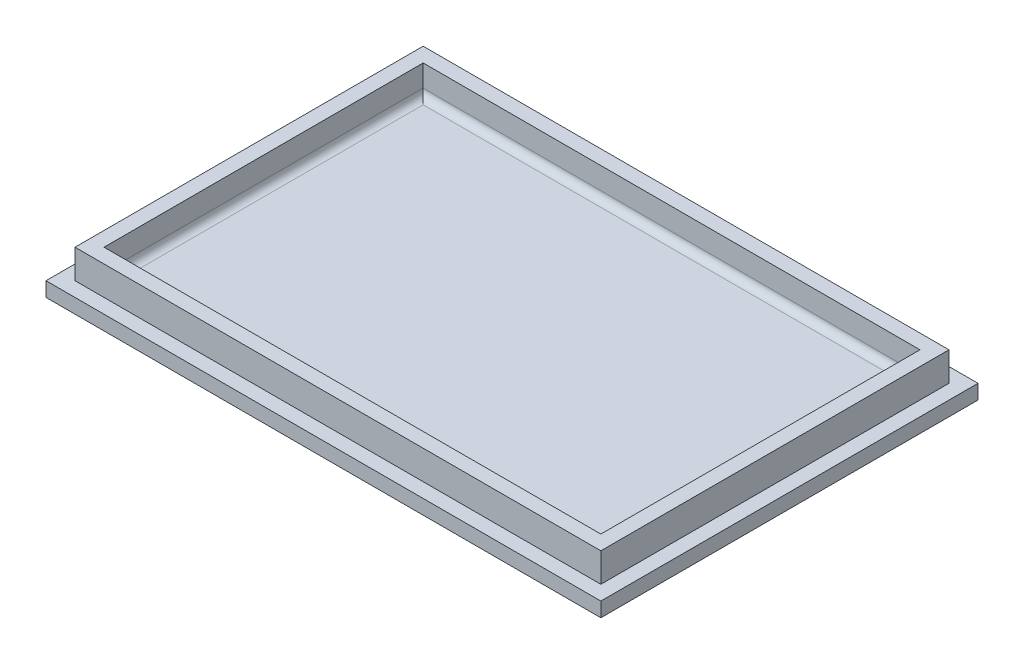
ISO-10303-21;
HEADER;
FILE_DESCRIPTION(('STEP AP214'),'2;1');
FILE_NAME('part.step','',(''),(''),'','','');
FILE_SCHEMA(('AUTOMOTIVE_DESIGN { 1 0 10303 214 1 1 1 1 }'));
ENDSEC;
DATA;
#1=APPLICATION_CONTEXT('core data for automotive mechanical design processes');
#2=APPLICATION_PROTOCOL_DEFINITION('international standard','automotive_design',2000,#1);
#3=PRODUCT_CONTEXT('',#1,'mechanical');
#4=PRODUCT('Part','Part','',(#3));
#5=PRODUCT_RELATED_PRODUCT_CATEGORY('part','',(#4));
#6=PRODUCT_DEFINITION_FORMATION('','',#4);
#7=PRODUCT_DEFINITION_CONTEXT('part definition',#1,'design');
#8=PRODUCT_DEFINITION('design','',#6,#7);
#9=PRODUCT_DEFINITION_SHAPE('','',#8);
#10=(LENGTH_UNIT() NAMED_UNIT(*) SI_UNIT(.MILLI.,.METRE.));
#11=(NAMED_UNIT(*) PLANE_ANGLE_UNIT() SI_UNIT($,.RADIAN.));
#12=(NAMED_UNIT(*) SI_UNIT($,.STERADIAN.) SOLID_ANGLE_UNIT());
#13=UNCERTAINTY_MEASURE_WITH_UNIT(LENGTH_MEASURE(1.E-05),#10,'distance_accuracy_value','');
#14=(GEOMETRIC_REPRESENTATION_CONTEXT(3) GLOBAL_UNCERTAINTY_ASSIGNED_CONTEXT((#13)) GLOBAL_UNIT_ASSIGNED_CONTEXT((#10,
#11,#12)) REPRESENTATION_CONTEXT('',''));
#15=CARTESIAN_POINT('',(0.,0.,0.));
#16=DIRECTION('',(0.,0.,1.));
#17=DIRECTION('',(1.,0.,0.));
#18=AXIS2_PLACEMENT_3D('',#15,#16,#17);
#19=CARTESIAN_POINT('',(0.,2.,0.));
#20=DIRECTION('',(0.,1.,0.));
#21=DIRECTION('',(0.,0.,1.));
#22=AXIS2_PLACEMENT_3D('',#19,#20,#21);
#23=PLANE('',#22);
#24=DIRECTION('',(0.,0.,1.));
#25=VECTOR('',#24,1.);
#26=CARTESIAN_POINT('',(-54.8143177737881,2.,-27.6349192100539));
#27=LINE('',#26,#25);
#28=CARTESIAN_POINT('',(-54.8143177737881,2.,-27.6349192100539));
#29=VERTEX_POINT('',#28);
#30=CARTESIAN_POINT('',(-54.8143177737881,2.,24.3650807899461));
#31=VERTEX_POINT('',#30);
#32=EDGE_CURVE('E223',#29,#31,#27,.T.);
#33=ORIENTED_EDGE('',*,*,#32,.T.);
#34=DIRECTION('',(1.,0.,0.));
#35=VECTOR('',#34,1.);
#36=CARTESIAN_POINT('',(-54.8143177737881,2.,24.3650807899461));
#37=LINE('',#36,#35);
#38=CARTESIAN_POINT('',(21.6856822262118,2.,24.3650807899461));
#39=VERTEX_POINT('',#38);
#40=EDGE_CURVE('E227',#31,#39,#37,.T.);
#41=ORIENTED_EDGE('',*,*,#40,.T.);
#42=DIRECTION('',(0.,0.,-1.));
#43=VECTOR('',#42,1.);
#44=CARTESIAN_POINT('',(21.6856822262118,2.,-27.6349192100539));
#45=LINE('',#44,#43);
#46=CARTESIAN_POINT('',(21.6856822262118,2.,-27.6349192100539));
#47=VERTEX_POINT('',#46);
#48=EDGE_CURVE('E231',#39,#47,#45,.T.);
#49=ORIENTED_EDGE('',*,*,#48,.T.);
#50=DIRECTION('',(-1.,0.,0.));
#51=VECTOR('',#50,1.);
#52=CARTESIAN_POINT('',(-54.8143177737881,2.,-27.6349192100539));
#53=LINE('',#52,#51);
#54=EDGE_CURVE('E234',#47,#29,#53,.T.);
#55=ORIENTED_EDGE('',*,*,#54,.T.);
#56=EDGE_LOOP('',(#33,#41,#49,#55));
#57=FACE_BOUND('',#56,.T.);
#58=DIRECTION('',(1.,0.,0.));
#59=VECTOR('',#58,1.);
#60=CARTESIAN_POINT('',(-52.8143177737881,2.,22.3650807899461));
#61=LINE('',#60,#59);
#62=CARTESIAN_POINT('',(-52.8143177737881,2.,22.3650807899461));
#63=VERTEX_POINT('',#62);
#64=CARTESIAN_POINT('',(19.6856822262119,2.,22.3650807899461));
#65=VERTEX_POINT('',#64);
#66=EDGE_CURVE('E200',#63,#65,#61,.T.);
#67=ORIENTED_EDGE('',*,*,#66,.F.);
#68=DIRECTION('',(0.,0.,1.));
#69=VECTOR('',#68,1.);
#70=CARTESIAN_POINT('',(-52.8143177737881,2.,-25.6349192100539));
#71=LINE('',#70,#69);
#72=CARTESIAN_POINT('',(-52.8143177737881,2.,-25.6349192100539));
#73=VERTEX_POINT('',#72);
#74=EDGE_CURVE('E160',#73,#63,#71,.T.);
#75=ORIENTED_EDGE('',*,*,#74,.F.);
#76=DIRECTION('',(-1.,0.,0.));
#77=VECTOR('',#76,1.);
#78=CARTESIAN_POINT('',(-52.8143177737881,2.,-25.6349192100539));
#79=LINE('',#78,#77);
#80=CARTESIAN_POINT('',(19.6856822262118,2.,-25.6349192100539));
#81=VERTEX_POINT('',#80);
#82=EDGE_CURVE('E187',#81,#73,#79,.T.);
#83=ORIENTED_EDGE('',*,*,#82,.F.);
#84=DIRECTION('',(0.,0.,-1.));
#85=VECTOR('',#84,1.);
#86=CARTESIAN_POINT('',(19.6856822262118,2.,-25.6349192100539));
#87=LINE('',#86,#85);
#88=EDGE_CURVE('E203',#65,#81,#87,.T.);
#89=ORIENTED_EDGE('',*,*,#88,.F.);
#90=EDGE_LOOP('',(#67,#75,#83,#89));
#91=FACE_BOUND('',#90,.T.);
#92=ADVANCED_FACE('F39',(#57,#91),#23,.T.);
#93=CARTESIAN_POINT('',(-54.8143177737881,2.,-27.6349192100539));
#94=DIRECTION('',(1.,0.,0.));
#95=DIRECTION('',(0.,0.,-1.));
#96=AXIS2_PLACEMENT_3D('',#93,#94,#95);
#97=PLANE('',#96);
#98=DIRECTION('',(0.,0.,1.));
#99=VECTOR('',#98,1.);
#100=CARTESIAN_POINT('',(-54.8143177737881,0.,-27.6349192100539));
#101=LINE('',#100,#99);
#102=CARTESIAN_POINT('',(-54.8143177737881,0.,-27.6349192100539));
#103=VERTEX_POINT('',#102);
#104=CARTESIAN_POINT('',(-54.8143177737881,0.,24.3650807899461));
#105=VERTEX_POINT('',#104);
#106=EDGE_CURVE('E222',#103,#105,#101,.T.);
#107=ORIENTED_EDGE('',*,*,#106,.T.);
#108=DIRECTION('',(0.,-1.,0.));
#109=VECTOR('',#108,1.);
#110=CARTESIAN_POINT('',(-54.8143177737881,2.,24.3650807899461));
#111=LINE('',#110,#109);
#112=EDGE_CURVE('E260',#31,#105,#111,.T.);
#113=ORIENTED_EDGE('',*,*,#112,.F.);
#114=ORIENTED_EDGE('',*,*,#32,.F.);
#115=DIRECTION('',(0.,-1.,0.));
#116=VECTOR('',#115,1.);
#117=CARTESIAN_POINT('',(-54.8143177737881,2.,-27.6349192100539));
#118=LINE('',#117,#116);
#119=EDGE_CURVE('E237',#29,#103,#118,.T.);
#120=ORIENTED_EDGE('',*,*,#119,.T.);
#121=EDGE_LOOP('',(#107,#113,#114,#120));
#122=FACE_BOUND('',#121,.T.);
#123=ADVANCED_FACE('F324',(#122),#97,.F.);
#124=CARTESIAN_POINT('',(-54.8143177737881,2.,24.3650807899461));
#125=DIRECTION('',(0.,0.,-1.));
#126=DIRECTION('',(-1.,0.,0.));
#127=AXIS2_PLACEMENT_3D('',#124,#125,#126);
#128=PLANE('',#127);
#129=DIRECTION('',(1.,0.,0.));
#130=VECTOR('',#129,1.);
#131=CARTESIAN_POINT('',(-54.8143177737881,0.,24.3650807899461));
#132=LINE('',#131,#130);
#133=CARTESIAN_POINT('',(21.6856822262118,0.,24.3650807899461));
#134=VERTEX_POINT('',#133);
#135=EDGE_CURVE('E241',#105,#134,#132,.T.);
#136=ORIENTED_EDGE('',*,*,#135,.T.);
#137=DIRECTION('',(0.,-1.,0.));
#138=VECTOR('',#137,1.);
#139=CARTESIAN_POINT('',(21.6856822262118,2.,24.3650807899461));
#140=LINE('',#139,#138);
#141=EDGE_CURVE('E256',#39,#134,#140,.T.);
#142=ORIENTED_EDGE('',*,*,#141,.F.);
#143=ORIENTED_EDGE('',*,*,#40,.F.);
#144=ORIENTED_EDGE('',*,*,#112,.T.);
#145=EDGE_LOOP('',(#136,#142,#143,#144));
#146=FACE_BOUND('',#145,.T.);
#147=ADVANCED_FACE('F329',(#146),#128,.F.);
#148=CARTESIAN_POINT('',(21.6856822262118,2.,-27.6349192100539));
#149=DIRECTION('',(-1.,0.,0.));
#150=DIRECTION('',(0.,0.,1.));
#151=AXIS2_PLACEMENT_3D('',#148,#149,#150);
#152=PLANE('',#151);
#153=DIRECTION('',(0.,0.,-1.));
#154=VECTOR('',#153,1.);
#155=CARTESIAN_POINT('',(21.6856822262118,0.,-27.6349192100539));
#156=LINE('',#155,#154);
#157=CARTESIAN_POINT('',(21.6856822262118,0.,-27.6349192100539));
#158=VERTEX_POINT('',#157);
#159=EDGE_CURVE('E244',#134,#158,#156,.T.);
#160=ORIENTED_EDGE('',*,*,#159,.T.);
#161=DIRECTION('',(0.,-1.,0.));
#162=VECTOR('',#161,1.);
#163=CARTESIAN_POINT('',(21.6856822262118,2.,-27.6349192100539));
#164=LINE('',#163,#162);
#165=EDGE_CURVE('E252',#47,#158,#164,.T.);
#166=ORIENTED_EDGE('',*,*,#165,.F.);
#167=ORIENTED_EDGE('',*,*,#48,.F.);
#168=ORIENTED_EDGE('',*,*,#141,.T.);
#169=EDGE_LOOP('',(#160,#166,#167,#168));
#170=FACE_BOUND('',#169,.T.);
#171=ADVANCED_FACE('F379',(#170),#152,.F.);
#172=CARTESIAN_POINT('',(-54.8143177737881,2.,-27.6349192100539));
#173=DIRECTION('',(0.,0.,1.));
#174=DIRECTION('',(1.,0.,0.));
#175=AXIS2_PLACEMENT_3D('',#172,#173,#174);
#176=PLANE('',#175);
#177=DIRECTION('',(-1.,0.,0.));
#178=VECTOR('',#177,1.);
#179=CARTESIAN_POINT('',(-54.8143177737881,0.,-27.6349192100539));
#180=LINE('',#179,#178);
#181=EDGE_CURVE('E228',#158,#103,#180,.T.);
#182=ORIENTED_EDGE('',*,*,#181,.T.);
#183=ORIENTED_EDGE('',*,*,#119,.F.);
#184=ORIENTED_EDGE('',*,*,#54,.F.);
#185=ORIENTED_EDGE('',*,*,#165,.T.);
#186=EDGE_LOOP('',(#182,#183,#184,#185));
#187=FACE_BOUND('',#186,.T.);
#188=ADVANCED_FACE('F374',(#187),#176,.F.);
#189=CARTESIAN_POINT('',(0.,0.,0.));
#190=DIRECTION('',(0.,1.,0.));
#191=DIRECTION('',(0.,0.,1.));
#192=AXIS2_PLACEMENT_3D('',#189,#190,#191);
#193=PLANE('',#192);
#194=ORIENTED_EDGE('',*,*,#106,.F.);
#195=ORIENTED_EDGE('',*,*,#181,.F.);
#196=ORIENTED_EDGE('',*,*,#159,.F.);
#197=ORIENTED_EDGE('',*,*,#135,.F.);
#198=EDGE_LOOP('',(#194,#195,#196,#197));
#199=FACE_BOUND('',#198,.T.);
#200=ADVANCED_FACE('F370',(#199),#193,.F.);
#201=CARTESIAN_POINT('',(0.,6.,0.));
#202=DIRECTION('',(0.,1.,0.));
#203=DIRECTION('',(0.,0.,1.));
#204=AXIS2_PLACEMENT_3D('',#201,#202,#203);
#205=PLANE('',#204);
#206=DIRECTION('',(0.,0.,1.));
#207=VECTOR('',#206,1.);
#208=CARTESIAN_POINT('',(-52.8143177737881,6.,-25.6349192100539));
#209=LINE('',#208,#207);
#210=CARTESIAN_POINT('',(-52.8143177737881,6.,-25.6349192100539));
#211=VERTEX_POINT('',#210);
#212=CARTESIAN_POINT('',(-52.8143177737881,6.,22.3650807899461));
#213=VERTEX_POINT('',#212);
#214=EDGE_CURVE('E182',#211,#213,#209,.T.);
#215=ORIENTED_EDGE('',*,*,#214,.T.);
#216=DIRECTION('',(1.,0.,0.));
#217=VECTOR('',#216,1.);
#218=CARTESIAN_POINT('',(-52.8143177737881,6.,22.3650807899461));
#219=LINE('',#218,#217);
#220=CARTESIAN_POINT('',(19.6856822262119,6.,22.3650807899461));
#221=VERTEX_POINT('',#220);
#222=EDGE_CURVE('E186',#213,#221,#219,.T.);
#223=ORIENTED_EDGE('',*,*,#222,.T.);
#224=DIRECTION('',(0.,0.,-1.));
#225=VECTOR('',#224,1.);
#226=CARTESIAN_POINT('',(19.6856822262118,6.,-25.6349192100539));
#227=LINE('',#226,#225);
#228=CARTESIAN_POINT('',(19.6856822262118,6.,-25.6349192100539));
#229=VERTEX_POINT('',#228);
#230=EDGE_CURVE('E190',#221,#229,#227,.T.);
#231=ORIENTED_EDGE('',*,*,#230,.T.);
#232=DIRECTION('',(-1.,0.,0.));
#233=VECTOR('',#232,1.);
#234=CARTESIAN_POINT('',(-52.8143177737881,6.,-25.6349192100539));
#235=LINE('',#234,#233);
#236=EDGE_CURVE('E193',#229,#211,#235,.T.);
#237=ORIENTED_EDGE('',*,*,#236,.T.);
#238=EDGE_LOOP('',(#215,#223,#231,#237));
#239=FACE_BOUND('',#238,.T.);
#240=DIRECTION('',(1.,0.,0.));
#241=VECTOR('',#240,1.);
#242=CARTESIAN_POINT('',(-50.8143177737881,6.,20.3650807899461));
#243=LINE('',#242,#241);
#244=CARTESIAN_POINT('',(-50.8143177737881,6.,20.3650807899461));
#245=VERTEX_POINT('',#244);
#246=CARTESIAN_POINT('',(17.6856822262119,6.,20.3650807899461));
#247=VERTEX_POINT('',#246);
#248=EDGE_CURVE('E150',#245,#247,#243,.T.);
#249=ORIENTED_EDGE('',*,*,#248,.F.);
#250=DIRECTION('',(0.,0.,1.));
#251=VECTOR('',#250,1.);
#252=CARTESIAN_POINT('',(-50.8143177737881,6.,-23.6349192100539));
#253=LINE('',#252,#251);
#254=CARTESIAN_POINT('',(-50.8143177737881,6.,-23.6349192100539));
#255=VERTEX_POINT('',#254);
#256=EDGE_CURVE('E141',#255,#245,#253,.T.);
#257=ORIENTED_EDGE('',*,*,#256,.F.);
#258=DIRECTION('',(-1.,0.,0.));
#259=VECTOR('',#258,1.);
#260=CARTESIAN_POINT('',(-50.8143177737881,6.,-23.6349192100539));
#261=LINE('',#260,#259);
#262=CARTESIAN_POINT('',(17.6856822262118,6.,-23.6349192100539));
#263=VERTEX_POINT('',#262);
#264=EDGE_CURVE('E170',#263,#255,#261,.T.);
#265=ORIENTED_EDGE('',*,*,#264,.F.);
#266=DIRECTION('',(0.,0.,-1.));
#267=VECTOR('',#266,1.);
#268=CARTESIAN_POINT('',(17.6856822262118,6.,-23.6349192100539));
#269=LINE('',#268,#267);
#270=EDGE_CURVE('E166',#247,#263,#269,.T.);
#271=ORIENTED_EDGE('',*,*,#270,.F.);
#272=EDGE_LOOP('',(#249,#257,#265,#271));
#273=FACE_BOUND('',#272,.T.);
#274=ADVANCED_FACE('F164',(#239,#273),#205,.T.);
#275=CARTESIAN_POINT('',(-52.8143177737881,6.,-25.6349192100539));
#276=DIRECTION('',(1.,0.,0.));
#277=DIRECTION('',(0.,0.,-1.));
#278=AXIS2_PLACEMENT_3D('',#275,#276,#277);
#279=PLANE('',#278);
#280=ORIENTED_EDGE('',*,*,#74,.T.);
#281=DIRECTION('',(0.,-1.,0.));
#282=VECTOR('',#281,1.);
#283=CARTESIAN_POINT('',(-52.8143177737881,6.,22.3650807899461));
#284=LINE('',#283,#282);
#285=EDGE_CURVE('E219',#213,#63,#284,.T.);
#286=ORIENTED_EDGE('',*,*,#285,.F.);
#287=ORIENTED_EDGE('',*,*,#214,.F.);
#288=DIRECTION('',(0.,-1.,0.));
#289=VECTOR('',#288,1.);
#290=CARTESIAN_POINT('',(-52.8143177737881,6.,-25.6349192100539));
#291=LINE('',#290,#289);
#292=EDGE_CURVE('E196',#211,#73,#291,.T.);
#293=ORIENTED_EDGE('',*,*,#292,.T.);
#294=EDGE_LOOP('',(#280,#286,#287,#293));
#295=FACE_BOUND('',#294,.T.);
#296=ADVANCED_FACE('F352',(#295),#279,.F.);
#297=CARTESIAN_POINT('',(-52.8143177737881,6.,22.3650807899461));
#298=DIRECTION('',(0.,0.,-1.));
#299=DIRECTION('',(-1.,0.,0.));
#300=AXIS2_PLACEMENT_3D('',#297,#298,#299);
#301=PLANE('',#300);
#302=ORIENTED_EDGE('',*,*,#66,.T.);
#303=DIRECTION('',(0.,-1.,0.));
#304=VECTOR('',#303,1.);
#305=CARTESIAN_POINT('',(19.6856822262119,6.,22.3650807899461));
#306=LINE('',#305,#304);
#307=EDGE_CURVE('E215',#221,#65,#306,.T.);
#308=ORIENTED_EDGE('',*,*,#307,.F.);
#309=ORIENTED_EDGE('',*,*,#222,.F.);
#310=ORIENTED_EDGE('',*,*,#285,.T.);
#311=EDGE_LOOP('',(#302,#308,#309,#310));
#312=FACE_BOUND('',#311,.T.);
#313=ADVANCED_FACE('F341',(#312),#301,.F.);
#314=CARTESIAN_POINT('',(19.6856822262118,6.,-25.6349192100539));
#315=DIRECTION('',(-1.,0.,0.));
#316=DIRECTION('',(0.,0.,1.));
#317=AXIS2_PLACEMENT_3D('',#314,#315,#316);
#318=PLANE('',#317);
#319=ORIENTED_EDGE('',*,*,#88,.T.);
#320=DIRECTION('',(0.,-1.,0.));
#321=VECTOR('',#320,1.);
#322=CARTESIAN_POINT('',(19.6856822262118,6.,-25.6349192100539));
#323=LINE('',#322,#321);
#324=EDGE_CURVE('E212',#229,#81,#323,.T.);
#325=ORIENTED_EDGE('',*,*,#324,.F.);
#326=ORIENTED_EDGE('',*,*,#230,.F.);
#327=ORIENTED_EDGE('',*,*,#307,.T.);
#328=EDGE_LOOP('',(#319,#325,#326,#327));
#329=FACE_BOUND('',#328,.T.);
#330=ADVANCED_FACE('F345',(#329),#318,.F.);
#331=CARTESIAN_POINT('',(-52.8143177737881,6.,-25.6349192100539));
#332=DIRECTION('',(0.,0.,1.));
#333=DIRECTION('',(1.,0.,0.));
#334=AXIS2_PLACEMENT_3D('',#331,#332,#333);
#335=PLANE('',#334);
#336=ORIENTED_EDGE('',*,*,#82,.T.);
#337=ORIENTED_EDGE('',*,*,#292,.F.);
#338=ORIENTED_EDGE('',*,*,#236,.F.);
#339=ORIENTED_EDGE('',*,*,#324,.T.);
#340=EDGE_LOOP('',(#336,#337,#338,#339));
#341=FACE_BOUND('',#340,.T.);
#342=ADVANCED_FACE('F354',(#341),#335,.F.);
#343=CARTESIAN_POINT('',(-50.8143177737881,6.,-23.6349192100539));
#344=DIRECTION('',(1.,0.,0.));
#345=DIRECTION('',(0.,0.,-1.));
#346=AXIS2_PLACEMENT_3D('',#343,#344,#345);
#347=PLANE('',#346);
#348=DIRECTION('',(0.,-1.,0.));
#349=VECTOR('',#348,1.);
#350=CARTESIAN_POINT('',(-50.8143177737881,6.,20.3650807899461));
#351=LINE('',#350,#349);
#352=CARTESIAN_POINT('',(-50.8143177737881,3.,20.3650807899461));
#353=VERTEX_POINT('',#352);
#354=EDGE_CURVE('E144',#245,#353,#351,.T.);
#355=ORIENTED_EDGE('',*,*,#354,.T.);
#356=DIRECTION('',(0.,0.,1.));
#357=VECTOR('',#356,1.);
#358=CARTESIAN_POINT('',(-50.8143177737881,3.,-23.6349192100539));
#359=LINE('',#358,#357);
#360=CARTESIAN_POINT('',(-50.8143177737881,3.,-23.6349192100539));
#361=VERTEX_POINT('',#360);
#362=EDGE_CURVE('E63',#353,#361,#359,.F.);
#363=ORIENTED_EDGE('',*,*,#362,.T.);
#364=DIRECTION('',(0.,-1.,0.));
#365=VECTOR('',#364,1.);
#366=CARTESIAN_POINT('',(-50.8143177737881,6.,-23.6349192100539));
#367=LINE('',#366,#365);
#368=EDGE_CURVE('E145',#255,#361,#367,.T.);
#369=ORIENTED_EDGE('',*,*,#368,.F.);
#370=ORIENTED_EDGE('',*,*,#256,.T.);
#371=EDGE_LOOP('',(#355,#363,#369,#370));
#372=FACE_BOUND('',#371,.T.);
#373=ADVANCED_FACE('F143',(#372),#347,.T.);
#374=CARTESIAN_POINT('',(-50.8143177737881,6.,20.3650807899461));
#375=DIRECTION('',(0.,0.,-1.));
#376=DIRECTION('',(-1.,0.,0.));
#377=AXIS2_PLACEMENT_3D('',#374,#375,#376);
#378=PLANE('',#377);
#379=DIRECTION('',(0.,-1.,0.));
#380=VECTOR('',#379,1.);
#381=CARTESIAN_POINT('',(17.6856822262119,6.,20.3650807899461));
#382=LINE('',#381,#380);
#383=CARTESIAN_POINT('',(17.6856822262119,3.,20.3650807899461));
#384=VERTEX_POINT('',#383);
#385=EDGE_CURVE('E161',#247,#384,#382,.T.);
#386=ORIENTED_EDGE('',*,*,#385,.T.);
#387=DIRECTION('',(1.,0.,0.));
#388=VECTOR('',#387,1.);
#389=CARTESIAN_POINT('',(-50.8143177737881,3.,20.3650807899461));
#390=LINE('',#389,#388);
#391=EDGE_CURVE('E158',#384,#353,#390,.F.);
#392=ORIENTED_EDGE('',*,*,#391,.T.);
#393=ORIENTED_EDGE('',*,*,#354,.F.);
#394=ORIENTED_EDGE('',*,*,#248,.T.);
#395=EDGE_LOOP('',(#386,#392,#393,#394));
#396=FACE_BOUND('',#395,.T.);
#397=ADVANCED_FACE('F155',(#396),#378,.T.);
#398=CARTESIAN_POINT('',(17.6856822262118,6.,-23.6349192100539));
#399=DIRECTION('',(-1.,0.,0.));
#400=DIRECTION('',(0.,0.,1.));
#401=AXIS2_PLACEMENT_3D('',#398,#399,#400);
#402=PLANE('',#401);
#403=DIRECTION('',(0.,-1.,0.));
#404=VECTOR('',#403,1.);
#405=CARTESIAN_POINT('',(17.6856822262118,6.,-23.6349192100539));
#406=LINE('',#405,#404);
#407=CARTESIAN_POINT('',(17.6856822262118,3.,-23.6349192100539));
#408=VERTEX_POINT('',#407);
#409=EDGE_CURVE('E177',#263,#408,#406,.T.);
#410=ORIENTED_EDGE('',*,*,#409,.T.);
#411=DIRECTION('',(0.,0.,-1.));
#412=VECTOR('',#411,1.);
#413=CARTESIAN_POINT('',(17.6856822262119,3.,20.3650807899461));
#414=LINE('',#413,#412);
#415=EDGE_CURVE('E49',#408,#384,#414,.F.);
#416=ORIENTED_EDGE('',*,*,#415,.T.);
#417=ORIENTED_EDGE('',*,*,#385,.F.);
#418=ORIENTED_EDGE('',*,*,#270,.T.);
#419=EDGE_LOOP('',(#410,#416,#417,#418));
#420=FACE_BOUND('',#419,.T.);
#421=ADVANCED_FACE('F307',(#420),#402,.T.);
#422=CARTESIAN_POINT('',(-50.8143177737881,6.,-23.6349192100539));
#423=DIRECTION('',(0.,0.,1.));
#424=DIRECTION('',(1.,0.,0.));
#425=AXIS2_PLACEMENT_3D('',#422,#423,#424);
#426=PLANE('',#425);
#427=ORIENTED_EDGE('',*,*,#368,.T.);
#428=DIRECTION('',(-1.,0.,0.));
#429=VECTOR('',#428,1.);
#430=CARTESIAN_POINT('',(17.6856822262118,3.,-23.6349192100539));
#431=LINE('',#430,#429);
#432=EDGE_CURVE('E11',#361,#408,#431,.F.);
#433=ORIENTED_EDGE('',*,*,#432,.T.);
#434=ORIENTED_EDGE('',*,*,#409,.F.);
#435=ORIENTED_EDGE('',*,*,#264,.T.);
#436=EDGE_LOOP('',(#427,#433,#434,#435));
#437=FACE_BOUND('',#436,.T.);
#438=ADVANCED_FACE('F314',(#437),#426,.T.);
#439=DIRECTION('',(0.,0.,1.));
#440=VECTOR('',#439,1.);
#441=CARTESIAN_POINT('',(-49.8143177737881,2.,20.3650807899461));
#442=LINE('',#441,#440);
#443=CARTESIAN_POINT('',(-49.8143177737881,2.,-22.6349192100539));
#444=VERTEX_POINT('',#443);
#445=CARTESIAN_POINT('',(-49.8143177737881,2.,19.3650807899461));
#446=VERTEX_POINT('',#445);
#447=EDGE_CURVE('E270',#444,#446,#442,.T.);
#448=ORIENTED_EDGE('',*,*,#447,.T.);
#449=DIRECTION('',(1.,0.,0.));
#450=VECTOR('',#449,1.);
#451=CARTESIAN_POINT('',(17.6856822262119,2.,19.3650807899461));
#452=LINE('',#451,#450);
#453=CARTESIAN_POINT('',(16.6856822262119,2.,19.3650807899461));
#454=VERTEX_POINT('',#453);
#455=EDGE_CURVE('E273',#446,#454,#452,.T.);
#456=ORIENTED_EDGE('',*,*,#455,.T.);
#457=DIRECTION('',(0.,0.,-1.));
#458=VECTOR('',#457,1.);
#459=CARTESIAN_POINT('',(16.6856822262118,2.,-23.6349192100539));
#460=LINE('',#459,#458);
#461=CARTESIAN_POINT('',(16.6856822262118,2.,-22.6349192100539));
#462=VERTEX_POINT('',#461);
#463=EDGE_CURVE('E267',#454,#462,#460,.T.);
#464=ORIENTED_EDGE('',*,*,#463,.T.);
#465=DIRECTION('',(-1.,0.,0.));
#466=VECTOR('',#465,1.);
#467=CARTESIAN_POINT('',(-50.8143177737881,2.,-22.6349192100539));
#468=LINE('',#467,#466);
#469=EDGE_CURVE('E264',#462,#444,#468,.T.);
#470=ORIENTED_EDGE('',*,*,#469,.T.);
#471=EDGE_LOOP('',(#448,#456,#464,#470));
#472=FACE_BOUND('',#471,.T.);
#473=ADVANCED_FACE('F312',(#472),#23,.T.);
#474=CARTESIAN_POINT('',(0.,3.,-22.6349192100539));
#475=DIRECTION('',(1.,0.,0.));
#476=DIRECTION('',(0.,0.,-1.));
#477=AXIS2_PLACEMENT_3D('',#474,#475,#476);
#478=CYLINDRICAL_SURFACE('',#477,1.);
#479=CARTESIAN_POINT('',(16.6856822262118,3.,-22.6349192100539));
#480=DIRECTION('',(0.707106781186547,0.,0.707106781186547));
#481=DIRECTION('',(-0.707106781186547,0.,0.707106781186548));
#482=AXIS2_PLACEMENT_3D('',#479,#480,#481);
#483=ELLIPSE('',#482,1.41421356237309,1.);
#484=EDGE_CURVE('E288',#408,#462,#483,.F.);
#485=ORIENTED_EDGE('',*,*,#484,.F.);
#486=ORIENTED_EDGE('',*,*,#432,.F.);
#487=CARTESIAN_POINT('',(-49.8143177737881,3.,-22.6349192100539));
#488=DIRECTION('',(0.707106781186547,0.,-0.707106781186548));
#489=DIRECTION('',(-0.707106781186548,0.,-0.707106781186547));
#490=AXIS2_PLACEMENT_3D('',#487,#488,#489);
#491=ELLIPSE('',#490,1.4142135623731,1.);
#492=EDGE_CURVE('E43',#444,#361,#491,.T.);
#493=ORIENTED_EDGE('',*,*,#492,.F.);
#494=ORIENTED_EDGE('',*,*,#469,.F.);
#495=EDGE_LOOP('',(#485,#486,#493,#494));
#496=FACE_BOUND('',#495,.T.);
#497=ADVANCED_FACE('F41',(#496),#478,.F.);
#498=CARTESIAN_POINT('',(-49.8143177737881,3.,0.));
#499=DIRECTION('',(0.,0.,-1.));
#500=DIRECTION('',(-1.,0.,0.));
#501=AXIS2_PLACEMENT_3D('',#498,#499,#500);
#502=CYLINDRICAL_SURFACE('',#501,1.);
#503=ORIENTED_EDGE('',*,*,#492,.T.);
#504=ORIENTED_EDGE('',*,*,#362,.F.);
#505=CARTESIAN_POINT('',(-49.8143177737881,3.,19.3650807899461));
#506=DIRECTION('',(-0.707106781186548,0.,-0.707106781186547));
#507=DIRECTION('',(-0.707106781186547,0.,0.707106781186548));
#508=AXIS2_PLACEMENT_3D('',#505,#506,#507);
#509=ELLIPSE('',#508,1.41421356237309,1.);
#510=EDGE_CURVE('E286',#446,#353,#509,.T.);
#511=ORIENTED_EDGE('',*,*,#510,.F.);
#512=ORIENTED_EDGE('',*,*,#447,.F.);
#513=EDGE_LOOP('',(#503,#504,#511,#512));
#514=FACE_BOUND('',#513,.T.);
#515=ADVANCED_FACE('F300',(#514),#502,.F.);
#516=CARTESIAN_POINT('',(16.6856822262119,3.,0.));
#517=DIRECTION('',(0.,0.,1.));
#518=DIRECTION('',(1.,0.,0.));
#519=AXIS2_PLACEMENT_3D('',#516,#517,#518);
#520=CYLINDRICAL_SURFACE('',#519,1.);
#521=ORIENTED_EDGE('',*,*,#484,.T.);
#522=ORIENTED_EDGE('',*,*,#463,.F.);
#523=CARTESIAN_POINT('',(16.6856822262119,3.,19.3650807899461));
#524=DIRECTION('',(-0.707106781186547,0.,0.707106781186548));
#525=DIRECTION('',(-0.707106781186547,0.,-0.707106781186547));
#526=AXIS2_PLACEMENT_3D('',#523,#524,#525);
#527=ELLIPSE('',#526,1.4142135623731,1.);
#528=EDGE_CURVE('E283',#384,#454,#527,.F.);
#529=ORIENTED_EDGE('',*,*,#528,.F.);
#530=ORIENTED_EDGE('',*,*,#415,.F.);
#531=EDGE_LOOP('',(#521,#522,#529,#530));
#532=FACE_BOUND('',#531,.T.);
#533=ADVANCED_FACE('F305',(#532),#520,.F.);
#534=CARTESIAN_POINT('',(0.,3.,19.3650807899461));
#535=DIRECTION('',(-1.,0.,0.));
#536=DIRECTION('',(0.,0.,1.));
#537=AXIS2_PLACEMENT_3D('',#534,#535,#536);
#538=CYLINDRICAL_SURFACE('',#537,1.);
#539=ORIENTED_EDGE('',*,*,#510,.T.);
#540=ORIENTED_EDGE('',*,*,#391,.F.);
#541=ORIENTED_EDGE('',*,*,#528,.T.);
#542=ORIENTED_EDGE('',*,*,#455,.F.);
#543=EDGE_LOOP('',(#539,#540,#541,#542));
#544=FACE_BOUND('',#543,.T.);
#545=ADVANCED_FACE('F309',(#544),#538,.F.);
#546=CLOSED_SHELL('',(#92,#123,#147,#171,#188,#200,#274,#296,#313,#330,#342,#373,#397,#421,#438,
#473,#497,#515,#533,#545));
#547=MANIFOLD_SOLID_BREP('B2',#546);
#548=ADVANCED_BREP_SHAPE_REPRESENTATION('',(#18,#547),#14);
#549=SHAPE_DEFINITION_REPRESENTATION(#9,#548);
ENDSEC;
END-ISO-10303-21;
